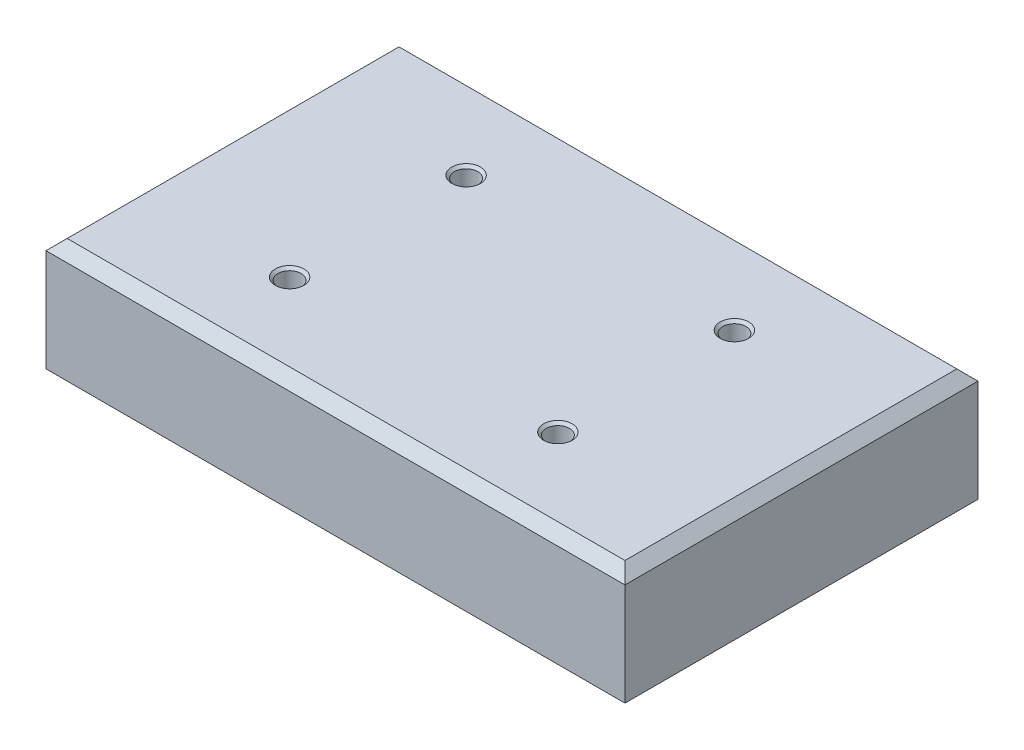
ISO-10303-21;
HEADER;
FILE_DESCRIPTION(('STEP AP214'),'2;1');
FILE_NAME('part.step','',(''),(''),'','','');
FILE_SCHEMA(('AUTOMOTIVE_DESIGN { 1 0 10303 214 1 1 1 1 }'));
ENDSEC;
DATA;
#1=APPLICATION_CONTEXT('core data for automotive mechanical design processes');
#2=APPLICATION_PROTOCOL_DEFINITION('international standard','automotive_design',2000,#1);
#3=PRODUCT_CONTEXT('',#1,'mechanical');
#4=PRODUCT('Part','Part','',(#3));
#5=PRODUCT_RELATED_PRODUCT_CATEGORY('part','',(#4));
#6=PRODUCT_DEFINITION_FORMATION('','',#4);
#7=PRODUCT_DEFINITION_CONTEXT('part definition',#1,'design');
#8=PRODUCT_DEFINITION('design','',#6,#7);
#9=PRODUCT_DEFINITION_SHAPE('','',#8);
#10=(LENGTH_UNIT() NAMED_UNIT(*) SI_UNIT(.MILLI.,.METRE.));
#11=(NAMED_UNIT(*) PLANE_ANGLE_UNIT() SI_UNIT($,.RADIAN.));
#12=(NAMED_UNIT(*) SI_UNIT($,.STERADIAN.) SOLID_ANGLE_UNIT());
#13=UNCERTAINTY_MEASURE_WITH_UNIT(LENGTH_MEASURE(1.E-05),#10,'distance_accuracy_value','');
#14=(GEOMETRIC_REPRESENTATION_CONTEXT(3) GLOBAL_UNCERTAINTY_ASSIGNED_CONTEXT((#13)) GLOBAL_UNIT_ASSIGNED_CONTEXT((#10,
#11,#12)) REPRESENTATION_CONTEXT('',''));
#15=CARTESIAN_POINT('',(0.,0.,0.));
#16=DIRECTION('',(0.,0.,1.));
#17=DIRECTION('',(1.,0.,0.));
#18=AXIS2_PLACEMENT_3D('',#15,#16,#17);
#19=CARTESIAN_POINT('',(41.,16.,-25.));
#20=DIRECTION('',(-1.,0.,0.));
#21=DIRECTION('',(0.,0.,1.));
#22=AXIS2_PLACEMENT_3D('',#19,#20,#21);
#23=PLANE('',#22);
#24=DIRECTION('',(0.,-1.,0.));
#25=VECTOR('',#24,1.);
#26=CARTESIAN_POINT('',(41.,16.,-25.));
#27=LINE('',#26,#25);
#28=CARTESIAN_POINT('',(41.,14.5,-25.));
#29=VERTEX_POINT('',#28);
#30=CARTESIAN_POINT('',(41.,0.,-25.));
#31=VERTEX_POINT('',#30);
#32=EDGE_CURVE('E189',#29,#31,#27,.T.);
#33=ORIENTED_EDGE('',*,*,#32,.F.);
#34=DIRECTION('',(0.,0.,1.));
#35=VECTOR('',#34,1.);
#36=CARTESIAN_POINT('',(41.,14.5,25.));
#37=LINE('',#36,#35);
#38=CARTESIAN_POINT('',(41.,14.5,25.));
#39=VERTEX_POINT('',#38);
#40=EDGE_CURVE('E205',#29,#39,#37,.T.);
#41=ORIENTED_EDGE('',*,*,#40,.T.);
#42=DIRECTION('',(0.,-1.,0.));
#43=VECTOR('',#42,1.);
#44=CARTESIAN_POINT('',(41.,16.,25.));
#45=LINE('',#44,#43);
#46=CARTESIAN_POINT('',(41.,0.,25.));
#47=VERTEX_POINT('',#46);
#48=EDGE_CURVE('E180',#39,#47,#45,.T.);
#49=ORIENTED_EDGE('',*,*,#48,.T.);
#50=DIRECTION('',(0.,0.,-1.));
#51=VECTOR('',#50,1.);
#52=CARTESIAN_POINT('',(41.,0.,-25.));
#53=LINE('',#52,#51);
#54=EDGE_CURVE('E164',#47,#31,#53,.T.);
#55=ORIENTED_EDGE('',*,*,#54,.T.);
#56=EDGE_LOOP('',(#33,#41,#49,#55));
#57=FACE_BOUND('',#56,.T.);
#58=ADVANCED_FACE('F44',(#57),#23,.F.);
#59=CARTESIAN_POINT('',(-41.,16.,-25.));
#60=DIRECTION('',(0.,0.,1.));
#61=DIRECTION('',(1.,0.,0.));
#62=AXIS2_PLACEMENT_3D('',#59,#60,#61);
#63=PLANE('',#62);
#64=DIRECTION('',(0.,-1.,0.));
#65=VECTOR('',#64,1.);
#66=CARTESIAN_POINT('',(-41.,16.,-25.));
#67=LINE('',#66,#65);
#68=CARTESIAN_POINT('',(-41.,14.5,-25.));
#69=VERTEX_POINT('',#68);
#70=CARTESIAN_POINT('',(-41.,0.,-25.));
#71=VERTEX_POINT('',#70);
#72=EDGE_CURVE('E186',#69,#71,#67,.T.);
#73=ORIENTED_EDGE('',*,*,#72,.F.);
#74=DIRECTION('',(1.,0.,0.));
#75=VECTOR('',#74,1.);
#76=CARTESIAN_POINT('',(41.,14.5,-25.));
#77=LINE('',#76,#75);
#78=EDGE_CURVE('E209',#69,#29,#77,.T.);
#79=ORIENTED_EDGE('',*,*,#78,.T.);
#80=ORIENTED_EDGE('',*,*,#32,.T.);
#81=DIRECTION('',(-1.,0.,0.));
#82=VECTOR('',#81,1.);
#83=CARTESIAN_POINT('',(-41.,0.,-25.));
#84=LINE('',#83,#82);
#85=EDGE_CURVE('E168',#31,#71,#84,.T.);
#86=ORIENTED_EDGE('',*,*,#85,.T.);
#87=EDGE_LOOP('',(#73,#79,#80,#86));
#88=FACE_BOUND('',#87,.T.);
#89=ADVANCED_FACE('F268',(#88),#63,.F.);
#90=CARTESIAN_POINT('',(-41.,16.,-25.));
#91=DIRECTION('',(1.,0.,0.));
#92=DIRECTION('',(0.,0.,-1.));
#93=AXIS2_PLACEMENT_3D('',#90,#91,#92);
#94=PLANE('',#93);
#95=DIRECTION('',(0.,-1.,0.));
#96=VECTOR('',#95,1.);
#97=CARTESIAN_POINT('',(-41.,16.,25.));
#98=LINE('',#97,#96);
#99=CARTESIAN_POINT('',(-41.,14.5,25.));
#100=VERTEX_POINT('',#99);
#101=CARTESIAN_POINT('',(-41.,0.,25.));
#102=VERTEX_POINT('',#101);
#103=EDGE_CURVE('E183',#100,#102,#98,.T.);
#104=ORIENTED_EDGE('',*,*,#103,.F.);
#105=DIRECTION('',(0.,0.,-1.));
#106=VECTOR('',#105,1.);
#107=CARTESIAN_POINT('',(-41.,14.5,-25.));
#108=LINE('',#107,#106);
#109=EDGE_CURVE('E55',#100,#69,#108,.T.);
#110=ORIENTED_EDGE('',*,*,#109,.T.);
#111=ORIENTED_EDGE('',*,*,#72,.T.);
#112=DIRECTION('',(0.,0.,1.));
#113=VECTOR('',#112,1.);
#114=CARTESIAN_POINT('',(-41.,0.,-25.));
#115=LINE('',#114,#113);
#116=EDGE_CURVE('E172',#71,#102,#115,.T.);
#117=ORIENTED_EDGE('',*,*,#116,.T.);
#118=EDGE_LOOP('',(#104,#110,#111,#117));
#119=FACE_BOUND('',#118,.T.);
#120=ADVANCED_FACE('F275',(#119),#94,.F.);
#121=CARTESIAN_POINT('',(-41.,16.,25.));
#122=DIRECTION('',(0.,0.,-1.));
#123=DIRECTION('',(-1.,0.,0.));
#124=AXIS2_PLACEMENT_3D('',#121,#122,#123);
#125=PLANE('',#124);
#126=ORIENTED_EDGE('',*,*,#48,.F.);
#127=DIRECTION('',(-1.,0.,0.));
#128=VECTOR('',#127,1.);
#129=CARTESIAN_POINT('',(-41.,14.5,25.));
#130=LINE('',#129,#128);
#131=EDGE_CURVE('E11',#39,#100,#130,.T.);
#132=ORIENTED_EDGE('',*,*,#131,.T.);
#133=ORIENTED_EDGE('',*,*,#103,.T.);
#134=DIRECTION('',(1.,0.,0.));
#135=VECTOR('',#134,1.);
#136=CARTESIAN_POINT('',(-41.,0.,25.));
#137=LINE('',#136,#135);
#138=EDGE_CURVE('E176',#102,#47,#137,.T.);
#139=ORIENTED_EDGE('',*,*,#138,.T.);
#140=EDGE_LOOP('',(#126,#132,#133,#139));
#141=FACE_BOUND('',#140,.T.);
#142=ADVANCED_FACE('F241',(#141),#125,.F.);
#143=CARTESIAN_POINT('',(0.,16.,0.));
#144=DIRECTION('',(0.,1.,0.));
#145=DIRECTION('',(0.,0.,1.));
#146=AXIS2_PLACEMENT_3D('',#143,#144,#145);
#147=PLANE('',#146);
#148=DIRECTION('',(1.,0.,0.));
#149=VECTOR('',#148,1.);
#150=CARTESIAN_POINT('',(41.,16.,23.5));
#151=LINE('',#150,#149);
#152=CARTESIAN_POINT('',(-39.5,16.,23.5));
#153=VERTEX_POINT('',#152);
#154=CARTESIAN_POINT('',(39.5,16.,23.5));
#155=VERTEX_POINT('',#154);
#156=EDGE_CURVE('E192',#153,#155,#151,.T.);
#157=ORIENTED_EDGE('',*,*,#156,.T.);
#158=DIRECTION('',(0.,0.,-1.));
#159=VECTOR('',#158,1.);
#160=CARTESIAN_POINT('',(39.5,16.,-25.));
#161=LINE('',#160,#159);
#162=CARTESIAN_POINT('',(39.5,16.,-23.5));
#163=VERTEX_POINT('',#162);
#164=EDGE_CURVE('E201',#155,#163,#161,.T.);
#165=ORIENTED_EDGE('',*,*,#164,.T.);
#166=DIRECTION('',(-1.,0.,0.));
#167=VECTOR('',#166,1.);
#168=CARTESIAN_POINT('',(-41.,16.,-23.5));
#169=LINE('',#168,#167);
#170=CARTESIAN_POINT('',(-39.5,16.,-23.5));
#171=VERTEX_POINT('',#170);
#172=EDGE_CURVE('E198',#163,#171,#169,.T.);
#173=ORIENTED_EDGE('',*,*,#172,.T.);
#174=DIRECTION('',(0.,0.,1.));
#175=VECTOR('',#174,1.);
#176=CARTESIAN_POINT('',(-39.5,16.,25.));
#177=LINE('',#176,#175);
#178=EDGE_CURVE('E195',#171,#153,#177,.T.);
#179=ORIENTED_EDGE('',*,*,#178,.T.);
#180=EDGE_LOOP('',(#157,#165,#173,#179));
#181=FACE_BOUND('',#180,.T.);
#182=CARTESIAN_POINT('',(-19.,16.,-12.5));
#183=DIRECTION('',(0.,1.,0.));
#184=DIRECTION('',(0.,0.,1.));
#185=AXIS2_PLACEMENT_3D('',#182,#183,#184);
#186=CIRCLE('',#185,2.025);
#187=CARTESIAN_POINT('',(-19.,16.,-10.475));
#188=VERTEX_POINT('',#187);
#189=EDGE_CURVE('E129',#188,#188,#186,.T.);
#190=ORIENTED_EDGE('',*,*,#189,.F.);
#191=EDGE_LOOP('',(#190));
#192=FACE_BOUND('',#191,.T.);
#193=CARTESIAN_POINT('',(-19.,16.,12.5));
#194=DIRECTION('',(0.,1.,0.));
#195=DIRECTION('',(0.,0.,1.));
#196=AXIS2_PLACEMENT_3D('',#193,#194,#195);
#197=CIRCLE('',#196,2.025);
#198=CARTESIAN_POINT('',(-19.,16.,14.525));
#199=VERTEX_POINT('',#198);
#200=EDGE_CURVE('E120',#199,#199,#197,.T.);
#201=ORIENTED_EDGE('',*,*,#200,.F.);
#202=EDGE_LOOP('',(#201));
#203=FACE_BOUND('',#202,.T.);
#204=CARTESIAN_POINT('',(19.,16.,-12.5));
#205=DIRECTION('',(0.,1.,0.));
#206=DIRECTION('',(0.,0.,1.));
#207=AXIS2_PLACEMENT_3D('',#204,#205,#206);
#208=CIRCLE('',#207,2.025);
#209=CARTESIAN_POINT('',(19.,16.,-10.475));
#210=VERTEX_POINT('',#209);
#211=EDGE_CURVE('E140',#210,#210,#208,.T.);
#212=ORIENTED_EDGE('',*,*,#211,.F.);
#213=EDGE_LOOP('',(#212));
#214=FACE_BOUND('',#213,.T.);
#215=CARTESIAN_POINT('',(19.,16.,12.5));
#216=DIRECTION('',(0.,1.,0.));
#217=DIRECTION('',(0.,0.,1.));
#218=AXIS2_PLACEMENT_3D('',#215,#216,#217);
#219=CIRCLE('',#218,2.025);
#220=CARTESIAN_POINT('',(19.,16.,14.525));
#221=VERTEX_POINT('',#220);
#222=EDGE_CURVE('E152',#221,#221,#219,.T.);
#223=ORIENTED_EDGE('',*,*,#222,.F.);
#224=EDGE_LOOP('',(#223));
#225=FACE_BOUND('',#224,.T.);
#226=ADVANCED_FACE('F237',(#181,#192,#203,#214,#225),#147,.T.);
#227=CARTESIAN_POINT('',(0.,0.,0.));
#228=DIRECTION('',(0.,1.,0.));
#229=DIRECTION('',(0.,0.,1.));
#230=AXIS2_PLACEMENT_3D('',#227,#228,#229);
#231=PLANE('',#230);
#232=ORIENTED_EDGE('',*,*,#54,.F.);
#233=ORIENTED_EDGE('',*,*,#138,.F.);
#234=ORIENTED_EDGE('',*,*,#116,.F.);
#235=ORIENTED_EDGE('',*,*,#85,.F.);
#236=EDGE_LOOP('',(#232,#233,#234,#235));
#237=FACE_BOUND('',#236,.T.);
#238=ADVANCED_FACE('F240',(#237),#231,.F.);
#239=CARTESIAN_POINT('',(19.,7.99999999999999,12.5));
#240=DIRECTION('',(0.,1.,0.));
#241=DIRECTION('',(0.,0.,1.));
#242=AXIS2_PLACEMENT_3D('',#239,#240,#241);
#243=CONICAL_SURFACE('',#242,1.64999999999902,1.02974425867639);
#244=CARTESIAN_POINT('',(19.,7.00857997860452,12.5));
#245=VERTEX_POINT('',#244);
#246=VERTEX_LOOP('',#245);
#247=FACE_BOUND('',#246,.T.);
#248=CARTESIAN_POINT('',(19.,7.99999999999999,12.5));
#249=DIRECTION('',(0.,1.,0.));
#250=DIRECTION('',(0.,0.,1.));
#251=AXIS2_PLACEMENT_3D('',#248,#249,#250);
#252=CIRCLE('',#251,1.64999999999902);
#253=CARTESIAN_POINT('',(19.,7.99999999999999,14.149999999999));
#254=VERTEX_POINT('',#253);
#255=EDGE_CURVE('E160',#254,#254,#252,.T.);
#256=ORIENTED_EDGE('',*,*,#255,.T.);
#257=EDGE_LOOP('',(#256));
#258=FACE_BOUND('',#257,.T.);
#259=ADVANCED_FACE('F263',(#247,#258),#243,.F.);
#260=CARTESIAN_POINT('',(19.,16.,12.5));
#261=DIRECTION('',(0.,1.,0.));
#262=DIRECTION('',(0.,0.,1.));
#263=AXIS2_PLACEMENT_3D('',#260,#261,#262);
#264=CYLINDRICAL_SURFACE('',#263,1.64999999999951);
#265=ORIENTED_EDGE('',*,*,#255,.F.);
#266=EDGE_LOOP('',(#265));
#267=FACE_BOUND('',#266,.T.);
#268=CARTESIAN_POINT('',(19.,15.625,12.5));
#269=DIRECTION('',(0.,1.,0.));
#270=DIRECTION('',(0.,0.,1.));
#271=AXIS2_PLACEMENT_3D('',#268,#269,#270);
#272=CIRCLE('',#271,1.65);
#273=CARTESIAN_POINT('',(19.,15.625,14.15));
#274=VERTEX_POINT('',#273);
#275=EDGE_CURVE('E156',#274,#274,#272,.T.);
#276=ORIENTED_EDGE('',*,*,#275,.T.);
#277=EDGE_LOOP('',(#276));
#278=FACE_BOUND('',#277,.T.);
#279=ADVANCED_FACE('F253',(#267,#278),#264,.F.);
#280=CARTESIAN_POINT('',(19.,16.,12.5));
#281=DIRECTION('',(0.,1.,0.));
#282=DIRECTION('',(0.,0.,1.));
#283=AXIS2_PLACEMENT_3D('',#280,#281,#282);
#284=CONICAL_SURFACE('',#283,2.025,0.785398163397444);
#285=ORIENTED_EDGE('',*,*,#275,.F.);
#286=EDGE_LOOP('',(#285));
#287=FACE_BOUND('',#286,.T.);
#288=ORIENTED_EDGE('',*,*,#222,.T.);
#289=EDGE_LOOP('',(#288));
#290=FACE_BOUND('',#289,.T.);
#291=ADVANCED_FACE('F250',(#287,#290),#284,.F.);
#292=CARTESIAN_POINT('',(19.,7.99999999999999,-12.5));
#293=DIRECTION('',(0.,1.,0.));
#294=DIRECTION('',(0.,0.,1.));
#295=AXIS2_PLACEMENT_3D('',#292,#293,#294);
#296=CONICAL_SURFACE('',#295,1.64999999999902,1.02974425867639);
#297=CARTESIAN_POINT('',(19.,7.00857997860452,-12.5));
#298=VERTEX_POINT('',#297);
#299=VERTEX_LOOP('',#298);
#300=FACE_BOUND('',#299,.T.);
#301=CARTESIAN_POINT('',(19.,7.99999999999999,-12.5));
#302=DIRECTION('',(0.,1.,0.));
#303=DIRECTION('',(0.,0.,1.));
#304=AXIS2_PLACEMENT_3D('',#301,#302,#303);
#305=CIRCLE('',#304,1.64999999999902);
#306=CARTESIAN_POINT('',(19.,7.99999999999999,-10.850000000001));
#307=VERTEX_POINT('',#306);
#308=EDGE_CURVE('E148',#307,#307,#305,.T.);
#309=ORIENTED_EDGE('',*,*,#308,.T.);
#310=EDGE_LOOP('',(#309));
#311=FACE_BOUND('',#310,.T.);
#312=ADVANCED_FACE('F252',(#300,#311),#296,.F.);
#313=CARTESIAN_POINT('',(19.,16.,-12.5));
#314=DIRECTION('',(0.,1.,0.));
#315=DIRECTION('',(0.,0.,1.));
#316=AXIS2_PLACEMENT_3D('',#313,#314,#315);
#317=CYLINDRICAL_SURFACE('',#316,1.64999999999951);
#318=ORIENTED_EDGE('',*,*,#308,.F.);
#319=EDGE_LOOP('',(#318));
#320=FACE_BOUND('',#319,.T.);
#321=CARTESIAN_POINT('',(19.,15.625,-12.5));
#322=DIRECTION('',(0.,1.,0.));
#323=DIRECTION('',(0.,0.,1.));
#324=AXIS2_PLACEMENT_3D('',#321,#322,#323);
#325=CIRCLE('',#324,1.65);
#326=CARTESIAN_POINT('',(19.,15.625,-10.85));
#327=VERTEX_POINT('',#326);
#328=EDGE_CURVE('E144',#327,#327,#325,.T.);
#329=ORIENTED_EDGE('',*,*,#328,.T.);
#330=EDGE_LOOP('',(#329));
#331=FACE_BOUND('',#330,.T.);
#332=ADVANCED_FACE('F260',(#320,#331),#317,.F.);
#333=CARTESIAN_POINT('',(19.,16.,-12.5));
#334=DIRECTION('',(0.,1.,0.));
#335=DIRECTION('',(0.,0.,1.));
#336=AXIS2_PLACEMENT_3D('',#333,#334,#335);
#337=CONICAL_SURFACE('',#336,2.025,0.785398163397444);
#338=ORIENTED_EDGE('',*,*,#328,.F.);
#339=EDGE_LOOP('',(#338));
#340=FACE_BOUND('',#339,.T.);
#341=ORIENTED_EDGE('',*,*,#211,.T.);
#342=EDGE_LOOP('',(#341));
#343=FACE_BOUND('',#342,.T.);
#344=ADVANCED_FACE('F410',(#340,#343),#337,.F.);
#345=CARTESIAN_POINT('',(-19.,7.99999999999999,12.5));
#346=DIRECTION('',(0.,1.,0.));
#347=DIRECTION('',(0.,0.,1.));
#348=AXIS2_PLACEMENT_3D('',#345,#346,#347);
#349=CONICAL_SURFACE('',#348,1.64999999999902,1.02974425867639);
#350=CARTESIAN_POINT('',(-19.,7.00857997860452,12.5));
#351=VERTEX_POINT('',#350);
#352=VERTEX_LOOP('',#351);
#353=FACE_BOUND('',#352,.T.);
#354=CARTESIAN_POINT('',(-19.,7.99999999999999,12.5));
#355=DIRECTION('',(0.,1.,0.));
#356=DIRECTION('',(0.,0.,1.));
#357=AXIS2_PLACEMENT_3D('',#354,#355,#356);
#358=CIRCLE('',#357,1.64999999999902);
#359=CARTESIAN_POINT('',(-19.,7.99999999999999,14.149999999999));
#360=VERTEX_POINT('',#359);
#361=EDGE_CURVE('E136',#360,#360,#358,.T.);
#362=ORIENTED_EDGE('',*,*,#361,.T.);
#363=EDGE_LOOP('',(#362));
#364=FACE_BOUND('',#363,.T.);
#365=ADVANCED_FACE('F357',(#353,#364),#349,.F.);
#366=CARTESIAN_POINT('',(-19.,16.,12.5));
#367=DIRECTION('',(0.,1.,0.));
#368=DIRECTION('',(0.,0.,1.));
#369=AXIS2_PLACEMENT_3D('',#366,#367,#368);
#370=CYLINDRICAL_SURFACE('',#369,1.64999999999951);
#371=ORIENTED_EDGE('',*,*,#361,.F.);
#372=EDGE_LOOP('',(#371));
#373=FACE_BOUND('',#372,.T.);
#374=CARTESIAN_POINT('',(-19.,15.625,12.5));
#375=DIRECTION('',(0.,1.,0.));
#376=DIRECTION('',(0.,0.,1.));
#377=AXIS2_PLACEMENT_3D('',#374,#375,#376);
#378=CIRCLE('',#377,1.65);
#379=CARTESIAN_POINT('',(-19.,15.625,14.15));
#380=VERTEX_POINT('',#379);
#381=EDGE_CURVE('E126',#380,#380,#378,.T.);
#382=ORIENTED_EDGE('',*,*,#381,.T.);
#383=EDGE_LOOP('',(#382));
#384=FACE_BOUND('',#383,.T.);
#385=ADVANCED_FACE('F351',(#373,#384),#370,.F.);
#386=CARTESIAN_POINT('',(-19.,16.,12.5));
#387=DIRECTION('',(0.,1.,0.));
#388=DIRECTION('',(0.,0.,1.));
#389=AXIS2_PLACEMENT_3D('',#386,#387,#388);
#390=CONICAL_SURFACE('',#389,2.025,0.785398163397444);
#391=ORIENTED_EDGE('',*,*,#381,.F.);
#392=EDGE_LOOP('',(#391));
#393=FACE_BOUND('',#392,.T.);
#394=ORIENTED_EDGE('',*,*,#200,.T.);
#395=EDGE_LOOP('',(#394));
#396=FACE_BOUND('',#395,.T.);
#397=ADVANCED_FACE('F113',(#393,#396),#390,.F.);
#398=CARTESIAN_POINT('',(-19.,7.99999999999999,-12.5));
#399=DIRECTION('',(0.,1.,0.));
#400=DIRECTION('',(0.,0.,1.));
#401=AXIS2_PLACEMENT_3D('',#398,#399,#400);
#402=CONICAL_SURFACE('',#401,1.64999999999902,1.02974425867639);
#403=CARTESIAN_POINT('',(-19.,7.00857997860452,-12.5));
#404=VERTEX_POINT('',#403);
#405=VERTEX_LOOP('',#404);
#406=FACE_BOUND('',#405,.T.);
#407=CARTESIAN_POINT('',(-19.,7.99999999999999,-12.5));
#408=DIRECTION('',(0.,1.,0.));
#409=DIRECTION('',(0.,0.,1.));
#410=AXIS2_PLACEMENT_3D('',#407,#408,#409);
#411=CIRCLE('',#410,1.64999999999902);
#412=CARTESIAN_POINT('',(-19.,7.99999999999999,-10.850000000001));
#413=VERTEX_POINT('',#412);
#414=EDGE_CURVE('E117',#413,#413,#411,.T.);
#415=ORIENTED_EDGE('',*,*,#414,.T.);
#416=EDGE_LOOP('',(#415));
#417=FACE_BOUND('',#416,.T.);
#418=ADVANCED_FACE('F109',(#406,#417),#402,.F.);
#419=CARTESIAN_POINT('',(-19.,16.,-12.5));
#420=DIRECTION('',(0.,1.,0.));
#421=DIRECTION('',(0.,0.,1.));
#422=AXIS2_PLACEMENT_3D('',#419,#420,#421);
#423=CYLINDRICAL_SURFACE('',#422,1.64999999999951);
#424=ORIENTED_EDGE('',*,*,#414,.F.);
#425=EDGE_LOOP('',(#424));
#426=FACE_BOUND('',#425,.T.);
#427=CARTESIAN_POINT('',(-19.,15.625,-12.5));
#428=DIRECTION('',(0.,1.,0.));
#429=DIRECTION('',(0.,0.,1.));
#430=AXIS2_PLACEMENT_3D('',#427,#428,#429);
#431=CIRCLE('',#430,1.65);
#432=CARTESIAN_POINT('',(-19.,15.625,-10.85));
#433=VERTEX_POINT('',#432);
#434=EDGE_CURVE('E121',#433,#433,#431,.T.);
#435=ORIENTED_EDGE('',*,*,#434,.T.);
#436=EDGE_LOOP('',(#435));
#437=FACE_BOUND('',#436,.T.);
#438=ADVANCED_FACE('F112',(#426,#437),#423,.F.);
#439=CARTESIAN_POINT('',(-19.,16.,-12.5));
#440=DIRECTION('',(0.,1.,0.));
#441=DIRECTION('',(0.,0.,1.));
#442=AXIS2_PLACEMENT_3D('',#439,#440,#441);
#443=CONICAL_SURFACE('',#442,2.025,0.785398163397444);
#444=ORIENTED_EDGE('',*,*,#434,.F.);
#445=EDGE_LOOP('',(#444));
#446=FACE_BOUND('',#445,.T.);
#447=ORIENTED_EDGE('',*,*,#189,.T.);
#448=EDGE_LOOP('',(#447));
#449=FACE_BOUND('',#448,.T.);
#450=ADVANCED_FACE('F235',(#446,#449),#443,.F.);
#451=CARTESIAN_POINT('',(-39.5,16.,0.));
#452=DIRECTION('',(-0.707106781186551,0.707106781186544,0.));
#453=DIRECTION('',(0.,0.,-1.));
#454=AXIS2_PLACEMENT_3D('',#451,#452,#453);
#455=PLANE('',#454);
#456=DIRECTION('',(-0.577350269189624,-0.577350269189629,-0.577350269189624));
#457=VECTOR('',#456,1.);
#458=CARTESIAN_POINT('',(-31.6666666666667,23.8333333333334,-15.6666666666667));
#459=LINE('',#458,#457);
#460=EDGE_CURVE('E219',#69,#171,#459,.F.);
#461=ORIENTED_EDGE('',*,*,#460,.F.);
#462=ORIENTED_EDGE('',*,*,#109,.F.);
#463=DIRECTION('',(-0.577350269189624,-0.577350269189629,0.577350269189624));
#464=VECTOR('',#463,1.);
#465=CARTESIAN_POINT('',(-26.3333333333334,29.1666666666667,10.3333333333334));
#466=LINE('',#465,#464);
#467=EDGE_CURVE('E49',#153,#100,#466,.T.);
#468=ORIENTED_EDGE('',*,*,#467,.F.);
#469=ORIENTED_EDGE('',*,*,#178,.F.);
#470=EDGE_LOOP('',(#461,#462,#468,#469));
#471=FACE_BOUND('',#470,.T.);
#472=ADVANCED_FACE('F47',(#471),#455,.T.);
#473=CARTESIAN_POINT('',(0.,16.,23.5));
#474=DIRECTION('',(0.,0.707106781186544,0.707106781186551));
#475=DIRECTION('',(-1.,0.,0.));
#476=AXIS2_PLACEMENT_3D('',#473,#474,#475);
#477=PLANE('',#476);
#478=ORIENTED_EDGE('',*,*,#467,.T.);
#479=ORIENTED_EDGE('',*,*,#131,.F.);
#480=DIRECTION('',(-0.577350269189624,0.577350269189629,-0.577350269189624));
#481=VECTOR('',#480,1.);
#482=CARTESIAN_POINT('',(26.3333333333334,29.1666666666667,10.3333333333334));
#483=LINE('',#482,#481);
#484=EDGE_CURVE('E217',#155,#39,#483,.F.);
#485=ORIENTED_EDGE('',*,*,#484,.F.);
#486=ORIENTED_EDGE('',*,*,#156,.F.);
#487=EDGE_LOOP('',(#478,#479,#485,#486));
#488=FACE_BOUND('',#487,.T.);
#489=ADVANCED_FACE('F294',(#488),#477,.T.);
#490=CARTESIAN_POINT('',(0.,16.,-23.5));
#491=DIRECTION('',(0.,0.707106781186544,-0.707106781186551));
#492=DIRECTION('',(1.,0.,0.));
#493=AXIS2_PLACEMENT_3D('',#490,#491,#492);
#494=PLANE('',#493);
#495=ORIENTED_EDGE('',*,*,#460,.T.);
#496=ORIENTED_EDGE('',*,*,#172,.F.);
#497=DIRECTION('',(0.577350269189624,-0.577350269189629,-0.577350269189624));
#498=VECTOR('',#497,1.);
#499=CARTESIAN_POINT('',(26.3333333333334,29.1666666666667,-10.3333333333334));
#500=LINE('',#499,#498);
#501=EDGE_CURVE('E214',#29,#163,#500,.F.);
#502=ORIENTED_EDGE('',*,*,#501,.F.);
#503=ORIENTED_EDGE('',*,*,#78,.F.);
#504=EDGE_LOOP('',(#495,#496,#502,#503));
#505=FACE_BOUND('',#504,.T.);
#506=ADVANCED_FACE('F288',(#505),#494,.T.);
#507=CARTESIAN_POINT('',(39.5,16.,0.));
#508=DIRECTION('',(0.707106781186551,0.707106781186544,0.));
#509=DIRECTION('',(0.,0.,1.));
#510=AXIS2_PLACEMENT_3D('',#507,#508,#509);
#511=PLANE('',#510);
#512=ORIENTED_EDGE('',*,*,#484,.T.);
#513=ORIENTED_EDGE('',*,*,#40,.F.);
#514=ORIENTED_EDGE('',*,*,#501,.T.);
#515=ORIENTED_EDGE('',*,*,#164,.F.);
#516=EDGE_LOOP('',(#512,#513,#514,#515));
#517=FACE_BOUND('',#516,.T.);
#518=ADVANCED_FACE('F282',(#517),#511,.T.);
#519=CLOSED_SHELL('',(#58,#89,#120,#142,#226,#238,#259,#279,#291,#312,#332,#344,#365,#385,#397,
#418,#438,#450,#472,#489,#506,#518));
#520=MANIFOLD_SOLID_BREP('B2',#519);
#521=ADVANCED_BREP_SHAPE_REPRESENTATION('',(#18,#520),#14);
#522=SHAPE_DEFINITION_REPRESENTATION(#9,#521);
ENDSEC;
END-ISO-10303-21;
